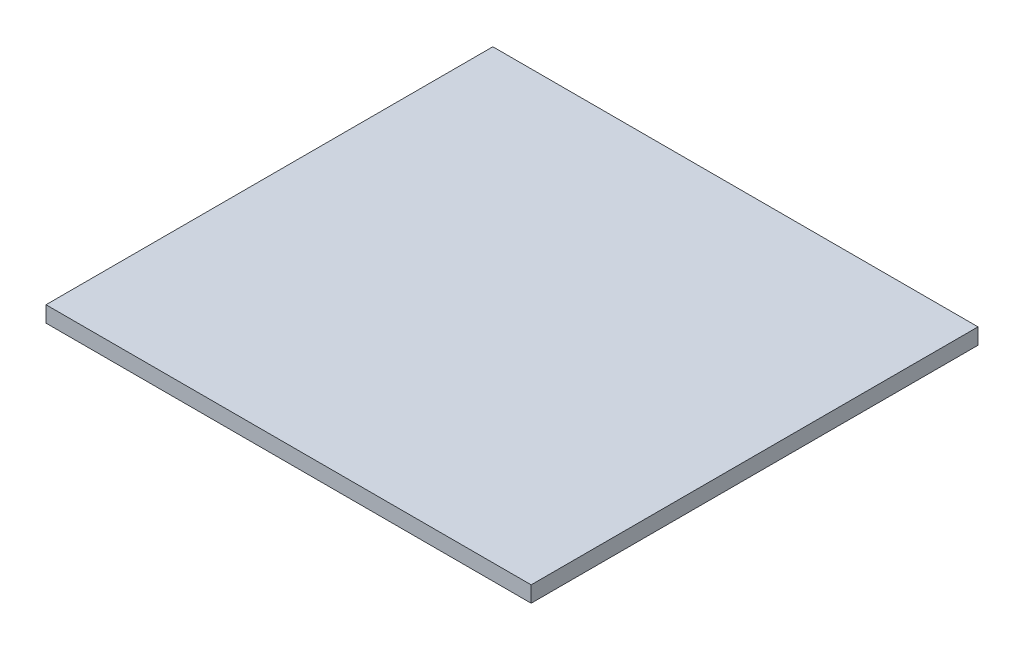
ISO-10303-21;
HEADER;
FILE_DESCRIPTION(('STEP AP214'),'2;1');
FILE_NAME('part.step','',(''),(''),'','','');
FILE_SCHEMA(('AUTOMOTIVE_DESIGN { 1 0 10303 214 1 1 1 1 }'));
ENDSEC;
DATA;
#1=APPLICATION_CONTEXT('core data for automotive mechanical design processes');
#2=APPLICATION_PROTOCOL_DEFINITION('international standard','automotive_design',2000,#1);
#3=PRODUCT_CONTEXT('',#1,'mechanical');
#4=PRODUCT('Part','Part','',(#3));
#5=PRODUCT_RELATED_PRODUCT_CATEGORY('part','',(#4));
#6=PRODUCT_DEFINITION_FORMATION('','',#4);
#7=PRODUCT_DEFINITION_CONTEXT('part definition',#1,'design');
#8=PRODUCT_DEFINITION('design','',#6,#7);
#9=PRODUCT_DEFINITION_SHAPE('','',#8);
#10=(LENGTH_UNIT() NAMED_UNIT(*) SI_UNIT(.MILLI.,.METRE.));
#11=(NAMED_UNIT(*) PLANE_ANGLE_UNIT() SI_UNIT($,.RADIAN.));
#12=(NAMED_UNIT(*) SI_UNIT($,.STERADIAN.) SOLID_ANGLE_UNIT());
#13=UNCERTAINTY_MEASURE_WITH_UNIT(LENGTH_MEASURE(1.E-05),#10,'distance_accuracy_value','');
#14=(GEOMETRIC_REPRESENTATION_CONTEXT(3) GLOBAL_UNCERTAINTY_ASSIGNED_CONTEXT((#13)) GLOBAL_UNIT_ASSIGNED_CONTEXT((#10,
#11,#12)) REPRESENTATION_CONTEXT('',''));
#15=CARTESIAN_POINT('',(0.,0.,0.));
#16=DIRECTION('',(0.,0.,1.));
#17=DIRECTION('',(1.,0.,0.));
#18=AXIS2_PLACEMENT_3D('',#15,#16,#17);
#19=CARTESIAN_POINT('',(0.,3.175,0.));
#20=DIRECTION('',(1.,0.,0.));
#21=DIRECTION('',(0.,0.,-1.));
#22=AXIS2_PLACEMENT_3D('',#19,#20,#21);
#23=PLANE('',#22);
#24=DIRECTION('',(0.,0.,1.));
#25=VECTOR('',#24,1.);
#26=CARTESIAN_POINT('',(0.,0.,0.));
#27=LINE('',#26,#25);
#28=CARTESIAN_POINT('',(0.,0.,-88.9));
#29=VERTEX_POINT('',#28);
#30=CARTESIAN_POINT('',(0.,0.,0.));
#31=VERTEX_POINT('',#30);
#32=EDGE_CURVE('E96',#29,#31,#27,.T.);
#33=ORIENTED_EDGE('',*,*,#32,.T.);
#34=DIRECTION('',(0.,-1.,0.));
#35=VECTOR('',#34,1.);
#36=CARTESIAN_POINT('',(0.,3.175,0.));
#37=LINE('',#36,#35);
#38=CARTESIAN_POINT('',(0.,3.175,0.));
#39=VERTEX_POINT('',#38);
#40=EDGE_CURVE('E11',#39,#31,#37,.T.);
#41=ORIENTED_EDGE('',*,*,#40,.F.);
#42=DIRECTION('',(0.,0.,1.));
#43=VECTOR('',#42,1.);
#44=CARTESIAN_POINT('',(0.,3.175,0.));
#45=LINE('',#44,#43);
#46=CARTESIAN_POINT('',(0.,3.175,-88.9));
#47=VERTEX_POINT('',#46);
#48=EDGE_CURVE('E84',#47,#39,#45,.T.);
#49=ORIENTED_EDGE('',*,*,#48,.F.);
#50=DIRECTION('',(0.,-1.,0.));
#51=VECTOR('',#50,1.);
#52=CARTESIAN_POINT('',(0.,3.175,-88.9));
#53=LINE('',#52,#51);
#54=EDGE_CURVE('E92',#47,#29,#53,.T.);
#55=ORIENTED_EDGE('',*,*,#54,.T.);
#56=EDGE_LOOP('',(#33,#41,#49,#55));
#57=FACE_BOUND('',#56,.T.);
#58=ADVANCED_FACE('F33',(#57),#23,.F.);
#59=CARTESIAN_POINT('',(0.,3.175,0.));
#60=DIRECTION('',(0.,0.,-1.));
#61=DIRECTION('',(-1.,0.,0.));
#62=AXIS2_PLACEMENT_3D('',#59,#60,#61);
#63=PLANE('',#62);
#64=DIRECTION('',(1.,0.,0.));
#65=VECTOR('',#64,1.);
#66=CARTESIAN_POINT('',(0.,0.,0.));
#67=LINE('',#66,#65);
#68=CARTESIAN_POINT('',(96.52,0.,0.));
#69=VERTEX_POINT('',#68);
#70=EDGE_CURVE('E88',#31,#69,#67,.T.);
#71=ORIENTED_EDGE('',*,*,#70,.T.);
#72=DIRECTION('',(0.,-1.,0.));
#73=VECTOR('',#72,1.);
#74=CARTESIAN_POINT('',(96.52,3.175,0.));
#75=LINE('',#74,#73);
#76=CARTESIAN_POINT('',(96.52,3.175,0.));
#77=VERTEX_POINT('',#76);
#78=EDGE_CURVE('E41',#77,#69,#75,.T.);
#79=ORIENTED_EDGE('',*,*,#78,.F.);
#80=DIRECTION('',(1.,0.,0.));
#81=VECTOR('',#80,1.);
#82=CARTESIAN_POINT('',(0.,3.175,0.));
#83=LINE('',#82,#81);
#84=EDGE_CURVE('E79',#39,#77,#83,.T.);
#85=ORIENTED_EDGE('',*,*,#84,.F.);
#86=ORIENTED_EDGE('',*,*,#40,.T.);
#87=EDGE_LOOP('',(#71,#79,#85,#86));
#88=FACE_BOUND('',#87,.T.);
#89=ADVANCED_FACE('F87',(#88),#63,.F.);
#90=CARTESIAN_POINT('',(96.52,3.175,0.));
#91=DIRECTION('',(-1.,0.,0.));
#92=DIRECTION('',(0.,0.,1.));
#93=AXIS2_PLACEMENT_3D('',#90,#91,#92);
#94=PLANE('',#93);
#95=DIRECTION('',(0.,0.,-1.));
#96=VECTOR('',#95,1.);
#97=CARTESIAN_POINT('',(96.52,0.,0.));
#98=LINE('',#97,#96);
#99=CARTESIAN_POINT('',(96.52,0.,-88.9));
#100=VERTEX_POINT('',#99);
#101=EDGE_CURVE('E66',#69,#100,#98,.T.);
#102=ORIENTED_EDGE('',*,*,#101,.T.);
#103=DIRECTION('',(0.,-1.,0.));
#104=VECTOR('',#103,1.);
#105=CARTESIAN_POINT('',(96.52,3.175,-88.9));
#106=LINE('',#105,#104);
#107=CARTESIAN_POINT('',(96.52,3.175,-88.9));
#108=VERTEX_POINT('',#107);
#109=EDGE_CURVE('E89',#108,#100,#106,.T.);
#110=ORIENTED_EDGE('',*,*,#109,.F.);
#111=DIRECTION('',(0.,0.,-1.));
#112=VECTOR('',#111,1.);
#113=CARTESIAN_POINT('',(96.52,3.175,0.));
#114=LINE('',#113,#112);
#115=EDGE_CURVE('E82',#77,#108,#114,.T.);
#116=ORIENTED_EDGE('',*,*,#115,.F.);
#117=ORIENTED_EDGE('',*,*,#78,.T.);
#118=EDGE_LOOP('',(#102,#110,#116,#117));
#119=FACE_BOUND('',#118,.T.);
#120=ADVANCED_FACE('F90',(#119),#94,.F.);
#121=CARTESIAN_POINT('',(0.,3.175,-88.9));
#122=DIRECTION('',(0.,0.,1.));
#123=DIRECTION('',(1.,0.,0.));
#124=AXIS2_PLACEMENT_3D('',#121,#122,#123);
#125=PLANE('',#124);
#126=DIRECTION('',(-1.,0.,0.));
#127=VECTOR('',#126,1.);
#128=CARTESIAN_POINT('',(0.,0.,-88.9));
#129=LINE('',#128,#127);
#130=EDGE_CURVE('E72',#100,#29,#129,.T.);
#131=ORIENTED_EDGE('',*,*,#130,.T.);
#132=ORIENTED_EDGE('',*,*,#54,.F.);
#133=DIRECTION('',(-1.,0.,0.));
#134=VECTOR('',#133,1.);
#135=CARTESIAN_POINT('',(0.,3.175,-88.9));
#136=LINE('',#135,#134);
#137=EDGE_CURVE('E49',#108,#47,#136,.T.);
#138=ORIENTED_EDGE('',*,*,#137,.F.);
#139=ORIENTED_EDGE('',*,*,#109,.T.);
#140=EDGE_LOOP('',(#131,#132,#138,#139));
#141=FACE_BOUND('',#140,.T.);
#142=ADVANCED_FACE('F103',(#141),#125,.F.);
#143=CARTESIAN_POINT('',(0.,3.175,0.));
#144=DIRECTION('',(0.,-1.,0.));
#145=DIRECTION('',(0.,0.,-1.));
#146=AXIS2_PLACEMENT_3D('',#143,#144,#145);
#147=PLANE('',#146);
#148=ORIENTED_EDGE('',*,*,#48,.T.);
#149=ORIENTED_EDGE('',*,*,#84,.T.);
#150=ORIENTED_EDGE('',*,*,#115,.T.);
#151=ORIENTED_EDGE('',*,*,#137,.T.);
#152=EDGE_LOOP('',(#148,#149,#150,#151));
#153=FACE_BOUND('',#152,.T.);
#154=ADVANCED_FACE('F80',(#153),#147,.F.);
#155=CARTESIAN_POINT('',(0.,0.,0.));
#156=DIRECTION('',(0.,-1.,0.));
#157=DIRECTION('',(0.,0.,-1.));
#158=AXIS2_PLACEMENT_3D('',#155,#156,#157);
#159=PLANE('',#158);
#160=ORIENTED_EDGE('',*,*,#32,.F.);
#161=ORIENTED_EDGE('',*,*,#130,.F.);
#162=ORIENTED_EDGE('',*,*,#101,.F.);
#163=ORIENTED_EDGE('',*,*,#70,.F.);
#164=EDGE_LOOP('',(#160,#161,#162,#163));
#165=FACE_BOUND('',#164,.T.);
#166=ADVANCED_FACE('F106',(#165),#159,.T.);
#167=CLOSED_SHELL('',(#58,#89,#120,#142,#154,#166));
#168=MANIFOLD_SOLID_BREP('B2',#167);
#169=ADVANCED_BREP_SHAPE_REPRESENTATION('',(#18,#168),#14);
#170=SHAPE_DEFINITION_REPRESENTATION(#9,#169);
ENDSEC;
END-ISO-10303-21;
